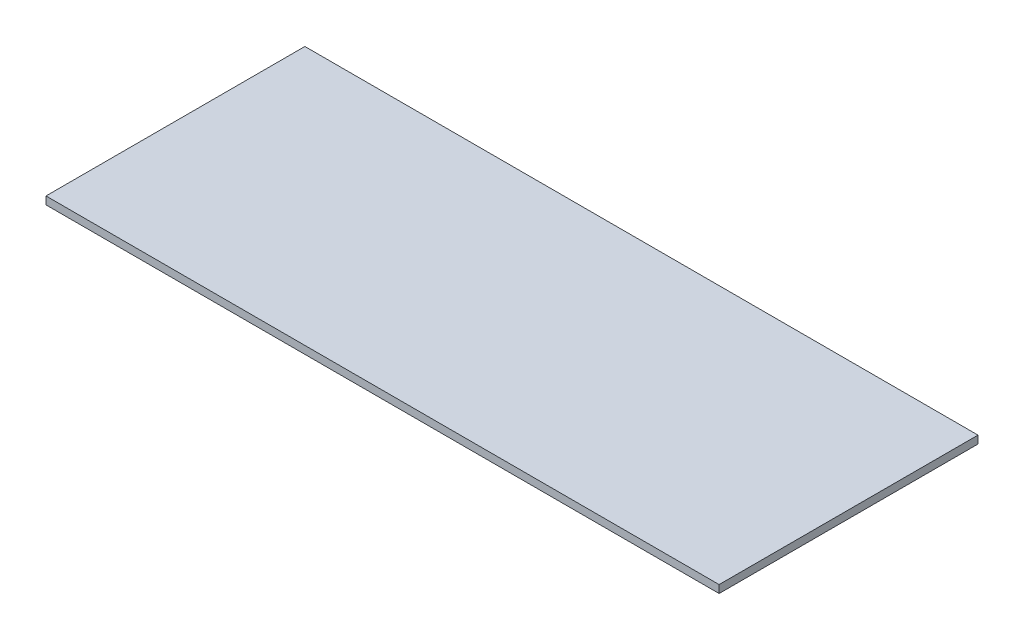
ISO-10303-21;
HEADER;
FILE_DESCRIPTION(('STEP AP214'),'2;1');
FILE_NAME('part.step','',(''),(''),'','','');
FILE_SCHEMA(('AUTOMOTIVE_DESIGN { 1 0 10303 214 1 1 1 1 }'));
ENDSEC;
DATA;
#1=APPLICATION_CONTEXT('core data for automotive mechanical design processes');
#2=APPLICATION_PROTOCOL_DEFINITION('international standard','automotive_design',2000,#1);
#3=PRODUCT_CONTEXT('',#1,'mechanical');
#4=PRODUCT('Part','Part','',(#3));
#5=PRODUCT_RELATED_PRODUCT_CATEGORY('part','',(#4));
#6=PRODUCT_DEFINITION_FORMATION('','',#4);
#7=PRODUCT_DEFINITION_CONTEXT('part definition',#1,'design');
#8=PRODUCT_DEFINITION('design','',#6,#7);
#9=PRODUCT_DEFINITION_SHAPE('','',#8);
#10=(LENGTH_UNIT() NAMED_UNIT(*) SI_UNIT(.MILLI.,.METRE.));
#11=(NAMED_UNIT(*) PLANE_ANGLE_UNIT() SI_UNIT($,.RADIAN.));
#12=(NAMED_UNIT(*) SI_UNIT($,.STERADIAN.) SOLID_ANGLE_UNIT());
#13=UNCERTAINTY_MEASURE_WITH_UNIT(LENGTH_MEASURE(1.E-05),#10,'distance_accuracy_value','');
#14=(GEOMETRIC_REPRESENTATION_CONTEXT(3) GLOBAL_UNCERTAINTY_ASSIGNED_CONTEXT((#13)) GLOBAL_UNIT_ASSIGNED_CONTEXT((#10,
#11,#12)) REPRESENTATION_CONTEXT('',''));
#15=CARTESIAN_POINT('',(0.,0.,0.));
#16=DIRECTION('',(0.,0.,1.));
#17=DIRECTION('',(1.,0.,0.));
#18=AXIS2_PLACEMENT_3D('',#15,#16,#17);
#19=CARTESIAN_POINT('',(-650.,15.,250.));
#20=DIRECTION('',(1.,0.,0.));
#21=DIRECTION('',(0.,0.,-1.));
#22=AXIS2_PLACEMENT_3D('',#19,#20,#21);
#23=PLANE('',#22);
#24=DIRECTION('',(0.,0.,1.));
#25=VECTOR('',#24,1.);
#26=CARTESIAN_POINT('',(-650.,0.,250.));
#27=LINE('',#26,#25);
#28=CARTESIAN_POINT('',(-650.,0.,-250.));
#29=VERTEX_POINT('',#28);
#30=CARTESIAN_POINT('',(-650.,0.,250.));
#31=VERTEX_POINT('',#30);
#32=EDGE_CURVE('E95',#29,#31,#27,.T.);
#33=ORIENTED_EDGE('',*,*,#32,.T.);
#34=DIRECTION('',(0.,-1.,0.));
#35=VECTOR('',#34,1.);
#36=CARTESIAN_POINT('',(-650.,15.,250.));
#37=LINE('',#36,#35);
#38=CARTESIAN_POINT('',(-650.,15.,250.));
#39=VERTEX_POINT('',#38);
#40=EDGE_CURVE('E11',#39,#31,#37,.T.);
#41=ORIENTED_EDGE('',*,*,#40,.F.);
#42=DIRECTION('',(0.,0.,1.));
#43=VECTOR('',#42,1.);
#44=CARTESIAN_POINT('',(-650.,15.,250.));
#45=LINE('',#44,#43);
#46=CARTESIAN_POINT('',(-650.,15.,-250.));
#47=VERTEX_POINT('',#46);
#48=EDGE_CURVE('E83',#47,#39,#45,.T.);
#49=ORIENTED_EDGE('',*,*,#48,.F.);
#50=DIRECTION('',(0.,-1.,0.));
#51=VECTOR('',#50,1.);
#52=CARTESIAN_POINT('',(-650.,15.,-250.));
#53=LINE('',#52,#51);
#54=EDGE_CURVE('E91',#47,#29,#53,.T.);
#55=ORIENTED_EDGE('',*,*,#54,.T.);
#56=EDGE_LOOP('',(#33,#41,#49,#55));
#57=FACE_BOUND('',#56,.T.);
#58=ADVANCED_FACE('F32',(#57),#23,.F.);
#59=CARTESIAN_POINT('',(650.,15.,250.));
#60=DIRECTION('',(0.,0.,-1.));
#61=DIRECTION('',(-1.,0.,0.));
#62=AXIS2_PLACEMENT_3D('',#59,#60,#61);
#63=PLANE('',#62);
#64=DIRECTION('',(1.,0.,0.));
#65=VECTOR('',#64,1.);
#66=CARTESIAN_POINT('',(650.,0.,250.));
#67=LINE('',#66,#65);
#68=CARTESIAN_POINT('',(650.,0.,250.));
#69=VERTEX_POINT('',#68);
#70=EDGE_CURVE('E87',#31,#69,#67,.T.);
#71=ORIENTED_EDGE('',*,*,#70,.T.);
#72=DIRECTION('',(0.,-1.,0.));
#73=VECTOR('',#72,1.);
#74=CARTESIAN_POINT('',(650.,15.,250.));
#75=LINE('',#74,#73);
#76=CARTESIAN_POINT('',(650.,15.,250.));
#77=VERTEX_POINT('',#76);
#78=EDGE_CURVE('E40',#77,#69,#75,.T.);
#79=ORIENTED_EDGE('',*,*,#78,.F.);
#80=DIRECTION('',(1.,0.,0.));
#81=VECTOR('',#80,1.);
#82=CARTESIAN_POINT('',(650.,15.,250.));
#83=LINE('',#82,#81);
#84=EDGE_CURVE('E78',#39,#77,#83,.T.);
#85=ORIENTED_EDGE('',*,*,#84,.F.);
#86=ORIENTED_EDGE('',*,*,#40,.T.);
#87=EDGE_LOOP('',(#71,#79,#85,#86));
#88=FACE_BOUND('',#87,.T.);
#89=ADVANCED_FACE('F86',(#88),#63,.F.);
#90=CARTESIAN_POINT('',(650.,15.,250.));
#91=DIRECTION('',(-1.,0.,0.));
#92=DIRECTION('',(0.,0.,1.));
#93=AXIS2_PLACEMENT_3D('',#90,#91,#92);
#94=PLANE('',#93);
#95=DIRECTION('',(0.,0.,-1.));
#96=VECTOR('',#95,1.);
#97=CARTESIAN_POINT('',(650.,0.,250.));
#98=LINE('',#97,#96);
#99=CARTESIAN_POINT('',(650.,0.,-250.));
#100=VERTEX_POINT('',#99);
#101=EDGE_CURVE('E65',#69,#100,#98,.T.);
#102=ORIENTED_EDGE('',*,*,#101,.T.);
#103=DIRECTION('',(0.,-1.,0.));
#104=VECTOR('',#103,1.);
#105=CARTESIAN_POINT('',(650.,15.,-250.));
#106=LINE('',#105,#104);
#107=CARTESIAN_POINT('',(650.,15.,-250.));
#108=VERTEX_POINT('',#107);
#109=EDGE_CURVE('E88',#108,#100,#106,.T.);
#110=ORIENTED_EDGE('',*,*,#109,.F.);
#111=DIRECTION('',(0.,0.,-1.));
#112=VECTOR('',#111,1.);
#113=CARTESIAN_POINT('',(650.,15.,250.));
#114=LINE('',#113,#112);
#115=EDGE_CURVE('E81',#77,#108,#114,.T.);
#116=ORIENTED_EDGE('',*,*,#115,.F.);
#117=ORIENTED_EDGE('',*,*,#78,.T.);
#118=EDGE_LOOP('',(#102,#110,#116,#117));
#119=FACE_BOUND('',#118,.T.);
#120=ADVANCED_FACE('F89',(#119),#94,.F.);
#121=CARTESIAN_POINT('',(650.,15.,-250.));
#122=DIRECTION('',(0.,0.,1.));
#123=DIRECTION('',(1.,0.,0.));
#124=AXIS2_PLACEMENT_3D('',#121,#122,#123);
#125=PLANE('',#124);
#126=DIRECTION('',(-1.,0.,0.));
#127=VECTOR('',#126,1.);
#128=CARTESIAN_POINT('',(650.,0.,-250.));
#129=LINE('',#128,#127);
#130=EDGE_CURVE('E71',#100,#29,#129,.T.);
#131=ORIENTED_EDGE('',*,*,#130,.T.);
#132=ORIENTED_EDGE('',*,*,#54,.F.);
#133=DIRECTION('',(-1.,0.,0.));
#134=VECTOR('',#133,1.);
#135=CARTESIAN_POINT('',(650.,15.,-250.));
#136=LINE('',#135,#134);
#137=EDGE_CURVE('E48',#108,#47,#136,.T.);
#138=ORIENTED_EDGE('',*,*,#137,.F.);
#139=ORIENTED_EDGE('',*,*,#109,.T.);
#140=EDGE_LOOP('',(#131,#132,#138,#139));
#141=FACE_BOUND('',#140,.T.);
#142=ADVANCED_FACE('F102',(#141),#125,.F.);
#143=CARTESIAN_POINT('',(0.,15.,0.));
#144=DIRECTION('',(0.,1.,0.));
#145=DIRECTION('',(0.,0.,1.));
#146=AXIS2_PLACEMENT_3D('',#143,#144,#145);
#147=PLANE('',#146);
#148=ORIENTED_EDGE('',*,*,#48,.T.);
#149=ORIENTED_EDGE('',*,*,#84,.T.);
#150=ORIENTED_EDGE('',*,*,#115,.T.);
#151=ORIENTED_EDGE('',*,*,#137,.T.);
#152=EDGE_LOOP('',(#148,#149,#150,#151));
#153=FACE_BOUND('',#152,.T.);
#154=ADVANCED_FACE('F79',(#153),#147,.T.);
#155=CARTESIAN_POINT('',(0.,0.,0.));
#156=DIRECTION('',(0.,1.,0.));
#157=DIRECTION('',(0.,0.,1.));
#158=AXIS2_PLACEMENT_3D('',#155,#156,#157);
#159=PLANE('',#158);
#160=ORIENTED_EDGE('',*,*,#32,.F.);
#161=ORIENTED_EDGE('',*,*,#130,.F.);
#162=ORIENTED_EDGE('',*,*,#101,.F.);
#163=ORIENTED_EDGE('',*,*,#70,.F.);
#164=EDGE_LOOP('',(#160,#161,#162,#163));
#165=FACE_BOUND('',#164,.T.);
#166=ADVANCED_FACE('F105',(#165),#159,.F.);
#167=CLOSED_SHELL('',(#58,#89,#120,#142,#154,#166));
#168=MANIFOLD_SOLID_BREP('B2',#167);
#169=ADVANCED_BREP_SHAPE_REPRESENTATION('',(#18,#168),#14);
#170=SHAPE_DEFINITION_REPRESENTATION(#9,#169);
ENDSEC;
END-ISO-10303-21;
